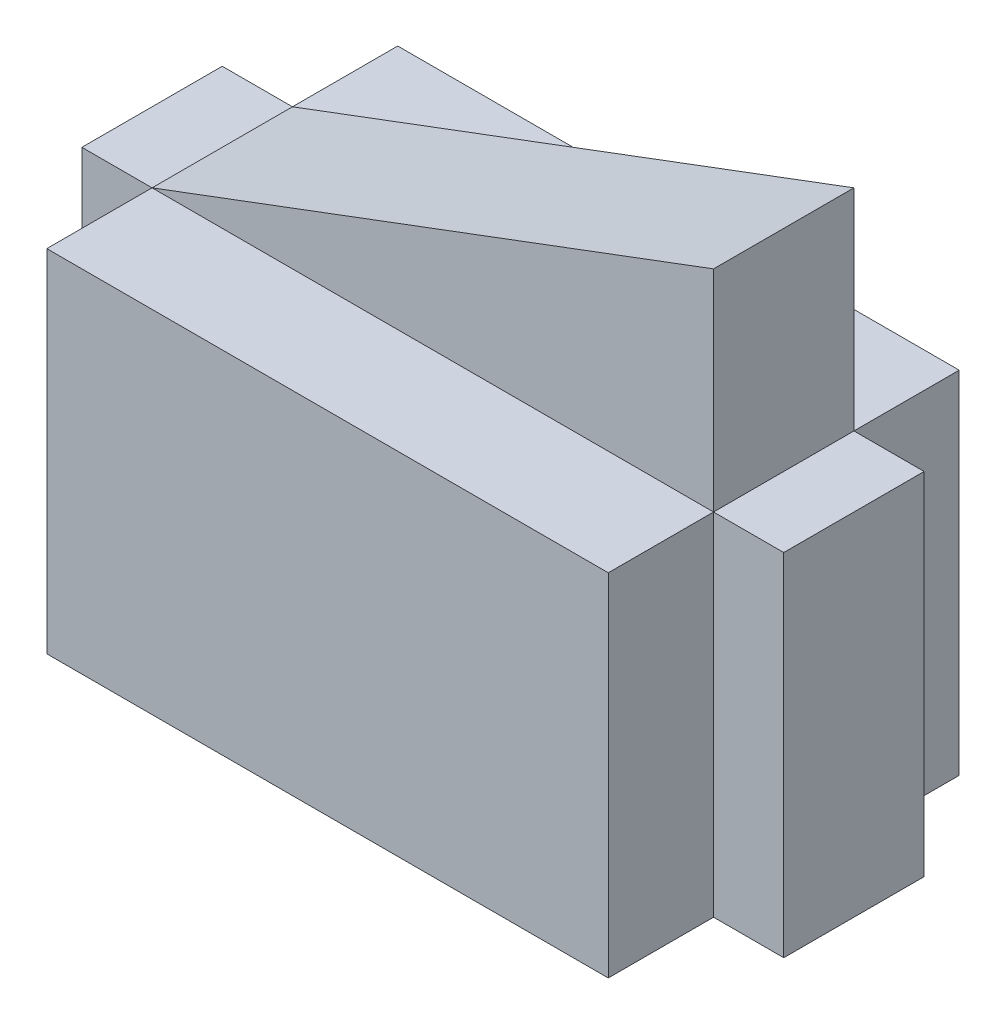
ISO-10303-21;
HEADER;
FILE_DESCRIPTION(('STEP AP214'),'2;1');
FILE_NAME('part.step','',(''),(''),'','','');
FILE_SCHEMA(('AUTOMOTIVE_DESIGN { 1 0 10303 214 1 1 1 1 }'));
ENDSEC;
DATA;
#1=APPLICATION_CONTEXT('core data for automotive mechanical design processes');
#2=APPLICATION_PROTOCOL_DEFINITION('international standard','automotive_design',2000,#1);
#3=PRODUCT_CONTEXT('',#1,'mechanical');
#4=PRODUCT('Part','Part','',(#3));
#5=PRODUCT_RELATED_PRODUCT_CATEGORY('part','',(#4));
#6=PRODUCT_DEFINITION_FORMATION('','',#4);
#7=PRODUCT_DEFINITION_CONTEXT('part definition',#1,'design');
#8=PRODUCT_DEFINITION('design','',#6,#7);
#9=PRODUCT_DEFINITION_SHAPE('','',#8);
#10=(LENGTH_UNIT() NAMED_UNIT(*) SI_UNIT(.MILLI.,.METRE.));
#11=(NAMED_UNIT(*) PLANE_ANGLE_UNIT() SI_UNIT($,.RADIAN.));
#12=(NAMED_UNIT(*) SI_UNIT($,.STERADIAN.) SOLID_ANGLE_UNIT());
#13=UNCERTAINTY_MEASURE_WITH_UNIT(LENGTH_MEASURE(1.E-05),#10,'distance_accuracy_value','');
#14=(GEOMETRIC_REPRESENTATION_CONTEXT(3) GLOBAL_UNCERTAINTY_ASSIGNED_CONTEXT((#13)) GLOBAL_UNIT_ASSIGNED_CONTEXT((#10,
#11,#12)) REPRESENTATION_CONTEXT('',''));
#15=CARTESIAN_POINT('',(0.,0.,0.));
#16=DIRECTION('',(0.,0.,1.));
#17=DIRECTION('',(1.,0.,0.));
#18=AXIS2_PLACEMENT_3D('',#15,#16,#17);
#19=CARTESIAN_POINT('',(4.,5.,5.));
#20=DIRECTION('',(-1.,0.,0.));
#21=DIRECTION('',(0.,-1.,0.));
#22=AXIS2_PLACEMENT_3D('',#19,#20,#21);
#23=PLANE('',#22);
#24=DIRECTION('',(0.,0.,-1.));
#25=VECTOR('',#24,1.);
#26=CARTESIAN_POINT('',(4.,5.,13.5));
#27=LINE('',#26,#25);
#28=CARTESIAN_POINT('',(4.,5.,5.));
#29=VERTEX_POINT('',#28);
#30=CARTESIAN_POINT('',(4.,5.,3.5));
#31=VERTEX_POINT('',#30);
#32=EDGE_CURVE('E150',#29,#31,#27,.T.);
#33=ORIENTED_EDGE('',*,*,#32,.F.);
#34=DIRECTION('',(0.,1.,0.));
#35=VECTOR('',#34,1.);
#36=CARTESIAN_POINT('',(4.,5.,5.));
#37=LINE('',#36,#35);
#38=CARTESIAN_POINT('',(4.,0.,5.));
#39=VERTEX_POINT('',#38);
#40=EDGE_CURVE('E205',#39,#29,#37,.T.);
#41=ORIENTED_EDGE('',*,*,#40,.F.);
#42=DIRECTION('',(0.,0.,-1.));
#43=VECTOR('',#42,1.);
#44=CARTESIAN_POINT('',(4.,0.,5.));
#45=LINE('',#44,#43);
#46=CARTESIAN_POINT('',(4.,0.,3.5));
#47=VERTEX_POINT('',#46);
#48=EDGE_CURVE('E56',#39,#47,#45,.T.);
#49=ORIENTED_EDGE('',*,*,#48,.T.);
#50=DIRECTION('',(0.,1.,0.));
#51=VECTOR('',#50,1.);
#52=CARTESIAN_POINT('',(4.,-2.23606797749979,3.5));
#53=LINE('',#52,#51);
#54=EDGE_CURVE('E258',#47,#31,#53,.T.);
#55=ORIENTED_EDGE('',*,*,#54,.T.);
#56=EDGE_LOOP('',(#33,#41,#49,#55));
#57=FACE_BOUND('',#56,.T.);
#58=ADVANCED_FACE('F33',(#57),#23,.F.);
#59=CARTESIAN_POINT('',(0.,0.,5.));
#60=DIRECTION('',(0.,0.,1.));
#61=DIRECTION('',(1.,0.,0.));
#62=AXIS2_PLACEMENT_3D('',#59,#60,#61);
#63=PLANE('',#62);
#64=ORIENTED_EDGE('',*,*,#40,.T.);
#65=DIRECTION('',(-1.,0.,0.));
#66=VECTOR('',#65,1.);
#67=CARTESIAN_POINT('',(0.,5.,5.));
#68=LINE('',#67,#66);
#69=CARTESIAN_POINT('',(-4.,5.,5.));
#70=VERTEX_POINT('',#69);
#71=EDGE_CURVE('E11',#29,#70,#68,.T.);
#72=ORIENTED_EDGE('',*,*,#71,.T.);
#73=DIRECTION('',(0.,-1.,0.));
#74=VECTOR('',#73,1.);
#75=CARTESIAN_POINT('',(-4.,5.,5.));
#76=LINE('',#75,#74);
#77=CARTESIAN_POINT('',(-4.,0.,5.));
#78=VERTEX_POINT('',#77);
#79=EDGE_CURVE('E173',#70,#78,#76,.T.);
#80=ORIENTED_EDGE('',*,*,#79,.T.);
#81=DIRECTION('',(1.,0.,0.));
#82=VECTOR('',#81,1.);
#83=CARTESIAN_POINT('',(-4.,0.,5.));
#84=LINE('',#83,#82);
#85=EDGE_CURVE('E202',#78,#39,#84,.T.);
#86=ORIENTED_EDGE('',*,*,#85,.T.);
#87=EDGE_LOOP('',(#64,#72,#80,#86));
#88=FACE_BOUND('',#87,.T.);
#89=ADVANCED_FACE('F281',(#88),#63,.T.);
#90=DIRECTION('',(0.,0.,1.));
#91=VECTOR('',#90,1.);
#92=CARTESIAN_POINT('',(4.,5.,-8.5));
#93=LINE('',#92,#91);
#94=CARTESIAN_POINT('',(4.,5.,0.));
#95=VERTEX_POINT('',#94);
#96=CARTESIAN_POINT('',(4.,5.,1.5));
#97=VERTEX_POINT('',#96);
#98=EDGE_CURVE('E230',#95,#97,#93,.T.);
#99=ORIENTED_EDGE('',*,*,#98,.T.);
#100=DIRECTION('',(0.,1.,0.));
#101=VECTOR('',#100,1.);
#102=CARTESIAN_POINT('',(4.,-2.23606797749979,1.5));
#103=LINE('',#102,#101);
#104=CARTESIAN_POINT('',(4.,0.,1.5));
#105=VERTEX_POINT('',#104);
#106=EDGE_CURVE('E48',#105,#97,#103,.T.);
#107=ORIENTED_EDGE('',*,*,#106,.F.);
#108=CARTESIAN_POINT('',(4.,0.,0.));
#109=VERTEX_POINT('',#108);
#110=EDGE_CURVE('E208',#105,#109,#45,.T.);
#111=ORIENTED_EDGE('',*,*,#110,.T.);
#112=DIRECTION('',(0.,1.,0.));
#113=VECTOR('',#112,1.);
#114=CARTESIAN_POINT('',(4.,5.,0.));
#115=LINE('',#114,#113);
#116=EDGE_CURVE('E203',#109,#95,#115,.T.);
#117=ORIENTED_EDGE('',*,*,#116,.T.);
#118=EDGE_LOOP('',(#99,#107,#111,#117));
#119=FACE_BOUND('',#118,.T.);
#120=ADVANCED_FACE('F229',(#119),#23,.F.);
#121=DIRECTION('',(0.,1.,0.));
#122=VECTOR('',#121,1.);
#123=CARTESIAN_POINT('',(4.,5.,3.5));
#124=LINE('',#123,#122);
#125=CARTESIAN_POINT('',(4.,8.,3.5));
#126=VERTEX_POINT('',#125);
#127=EDGE_CURVE('E136',#31,#126,#124,.T.);
#128=ORIENTED_EDGE('',*,*,#127,.F.);
#129=DIRECTION('',(0.,0.,-1.));
#130=VECTOR('',#129,1.);
#131=CARTESIAN_POINT('',(4.,5.,3.5));
#132=LINE('',#131,#130);
#133=EDGE_CURVE('E253',#31,#97,#132,.T.);
#134=ORIENTED_EDGE('',*,*,#133,.T.);
#135=DIRECTION('',(0.,1.,0.));
#136=VECTOR('',#135,1.);
#137=CARTESIAN_POINT('',(4.,5.,1.5));
#138=LINE('',#137,#136);
#139=CARTESIAN_POINT('',(4.,8.,1.5));
#140=VERTEX_POINT('',#139);
#141=EDGE_CURVE('E437',#97,#140,#138,.T.);
#142=ORIENTED_EDGE('',*,*,#141,.T.);
#143=DIRECTION('',(0.,0.,-1.));
#144=VECTOR('',#143,1.);
#145=CARTESIAN_POINT('',(4.,8.,3.5));
#146=LINE('',#145,#144);
#147=EDGE_CURVE('E181',#126,#140,#146,.T.);
#148=ORIENTED_EDGE('',*,*,#147,.F.);
#149=EDGE_LOOP('',(#128,#134,#142,#148));
#150=FACE_BOUND('',#149,.T.);
#151=ADVANCED_FACE('F283',(#150),#23,.F.);
#152=CARTESIAN_POINT('',(0.,0.,0.));
#153=DIRECTION('',(0.,0.,1.));
#154=DIRECTION('',(1.,0.,0.));
#155=AXIS2_PLACEMENT_3D('',#152,#153,#154);
#156=PLANE('',#155);
#157=DIRECTION('',(-1.,0.,0.));
#158=VECTOR('',#157,1.);
#159=CARTESIAN_POINT('',(0.,5.,0.));
#160=LINE('',#159,#158);
#161=CARTESIAN_POINT('',(-4.,5.,0.));
#162=VERTEX_POINT('',#161);
#163=EDGE_CURVE('E175',#95,#162,#160,.T.);
#164=ORIENTED_EDGE('',*,*,#163,.F.);
#165=ORIENTED_EDGE('',*,*,#116,.F.);
#166=DIRECTION('',(1.,0.,0.));
#167=VECTOR('',#166,1.);
#168=CARTESIAN_POINT('',(-4.,0.,0.));
#169=LINE('',#168,#167);
#170=CARTESIAN_POINT('',(-4.,0.,0.));
#171=VERTEX_POINT('',#170);
#172=EDGE_CURVE('E210',#171,#109,#169,.T.);
#173=ORIENTED_EDGE('',*,*,#172,.F.);
#174=DIRECTION('',(0.,-1.,0.));
#175=VECTOR('',#174,1.);
#176=CARTESIAN_POINT('',(-4.,5.,0.));
#177=LINE('',#176,#175);
#178=EDGE_CURVE('E200',#162,#171,#177,.T.);
#179=ORIENTED_EDGE('',*,*,#178,.F.);
#180=EDGE_LOOP('',(#164,#165,#173,#179));
#181=FACE_BOUND('',#180,.T.);
#182=ADVANCED_FACE('F228',(#181),#156,.F.);
#183=CARTESIAN_POINT('',(4.,8.,3.5));
#184=DIRECTION('',(0.351123441588392,-0.936329177569044,0.));
#185=DIRECTION('',(0.936329177569044,0.351123441588392,0.));
#186=AXIS2_PLACEMENT_3D('',#183,#184,#185);
#187=PLANE('',#186);
#188=DIRECTION('',(0.,0.,-1.));
#189=VECTOR('',#188,1.);
#190=CARTESIAN_POINT('',(-4.,5.,3.5));
#191=LINE('',#190,#189);
#192=CARTESIAN_POINT('',(-4.,5.,3.5));
#193=VERTEX_POINT('',#192);
#194=CARTESIAN_POINT('',(-4.,5.,1.5));
#195=VERTEX_POINT('',#194);
#196=EDGE_CURVE('E141',#193,#195,#191,.T.);
#197=ORIENTED_EDGE('',*,*,#196,.F.);
#198=DIRECTION('',(-0.936329177569045,-0.351123441588392,0.));
#199=VECTOR('',#198,1.);
#200=CARTESIAN_POINT('',(4.,8.,3.5));
#201=LINE('',#200,#199);
#202=EDGE_CURVE('E131',#126,#193,#201,.T.);
#203=ORIENTED_EDGE('',*,*,#202,.F.);
#204=ORIENTED_EDGE('',*,*,#147,.T.);
#205=DIRECTION('',(-0.936329177569045,-0.351123441588392,0.));
#206=VECTOR('',#205,1.);
#207=CARTESIAN_POINT('',(4.,8.,1.5));
#208=LINE('',#207,#206);
#209=EDGE_CURVE('E179',#140,#195,#208,.T.);
#210=ORIENTED_EDGE('',*,*,#209,.T.);
#211=EDGE_LOOP('',(#197,#203,#204,#210));
#212=FACE_BOUND('',#211,.T.);
#213=ADVANCED_FACE('F177',(#212),#187,.F.);
#214=CARTESIAN_POINT('',(-4.,5.,5.));
#215=DIRECTION('',(0.,-1.,0.));
#216=DIRECTION('',(1.,0.,0.));
#217=AXIS2_PLACEMENT_3D('',#214,#215,#216);
#218=PLANE('',#217);
#219=ORIENTED_EDGE('',*,*,#133,.F.);
#220=DIRECTION('',(1.,0.,0.));
#221=VECTOR('',#220,1.);
#222=CARTESIAN_POINT('',(4.,5.,3.5));
#223=LINE('',#222,#221);
#224=CARTESIAN_POINT('',(5.,5.,3.5));
#225=VERTEX_POINT('',#224);
#226=EDGE_CURVE('E249',#31,#225,#223,.T.);
#227=ORIENTED_EDGE('',*,*,#226,.T.);
#228=DIRECTION('',(0.,0.,-1.));
#229=VECTOR('',#228,1.);
#230=CARTESIAN_POINT('',(5.,5.,1.5));
#231=LINE('',#230,#229);
#232=CARTESIAN_POINT('',(5.,5.,1.5));
#233=VERTEX_POINT('',#232);
#234=EDGE_CURVE('E252',#225,#233,#231,.T.);
#235=ORIENTED_EDGE('',*,*,#234,.T.);
#236=DIRECTION('',(-1.,0.,0.));
#237=VECTOR('',#236,1.);
#238=CARTESIAN_POINT('',(4.,5.,1.5));
#239=LINE('',#238,#237);
#240=EDGE_CURVE('E256',#233,#97,#239,.T.);
#241=ORIENTED_EDGE('',*,*,#240,.T.);
#242=EDGE_LOOP('',(#219,#227,#235,#241));
#243=FACE_BOUND('',#242,.T.);
#244=ADVANCED_FACE('F315',(#243),#218,.F.);
#245=CARTESIAN_POINT('',(-4.,5.,5.));
#246=DIRECTION('',(1.,0.,0.));
#247=DIRECTION('',(0.,1.,0.));
#248=AXIS2_PLACEMENT_3D('',#245,#246,#247);
#249=PLANE('',#248);
#250=ORIENTED_EDGE('',*,*,#79,.F.);
#251=DIRECTION('',(0.,0.,1.));
#252=VECTOR('',#251,1.);
#253=CARTESIAN_POINT('',(-4.,5.,0.));
#254=LINE('',#253,#252);
#255=EDGE_CURVE('E148',#193,#70,#254,.T.);
#256=ORIENTED_EDGE('',*,*,#255,.F.);
#257=DIRECTION('',(0.,1.,0.));
#258=VECTOR('',#257,1.);
#259=CARTESIAN_POINT('',(-4.,-2.23606797749979,3.5));
#260=LINE('',#259,#258);
#261=CARTESIAN_POINT('',(-4.,0.,3.5));
#262=VERTEX_POINT('',#261);
#263=EDGE_CURVE('E171',#262,#193,#260,.T.);
#264=ORIENTED_EDGE('',*,*,#263,.F.);
#265=DIRECTION('',(0.,0.,-1.));
#266=VECTOR('',#265,1.);
#267=CARTESIAN_POINT('',(-4.,0.,5.));
#268=LINE('',#267,#266);
#269=EDGE_CURVE('E41',#78,#262,#268,.T.);
#270=ORIENTED_EDGE('',*,*,#269,.F.);
#271=EDGE_LOOP('',(#250,#256,#264,#270));
#272=FACE_BOUND('',#271,.T.);
#273=ADVANCED_FACE('F169',(#272),#249,.F.);
#274=DIRECTION('',(0.,1.,0.));
#275=VECTOR('',#274,1.);
#276=CARTESIAN_POINT('',(-4.,-2.23606797749979,1.5));
#277=LINE('',#276,#275);
#278=CARTESIAN_POINT('',(-4.,0.,1.5));
#279=VERTEX_POINT('',#278);
#280=EDGE_CURVE('E165',#279,#195,#277,.T.);
#281=ORIENTED_EDGE('',*,*,#280,.T.);
#282=EDGE_CURVE('E174',#162,#195,#254,.T.);
#283=ORIENTED_EDGE('',*,*,#282,.F.);
#284=ORIENTED_EDGE('',*,*,#178,.T.);
#285=EDGE_CURVE('E215',#279,#171,#268,.T.);
#286=ORIENTED_EDGE('',*,*,#285,.F.);
#287=EDGE_LOOP('',(#281,#283,#284,#286));
#288=FACE_BOUND('',#287,.T.);
#289=ADVANCED_FACE('F35',(#288),#249,.F.);
#290=CARTESIAN_POINT('',(-4.,0.,5.));
#291=DIRECTION('',(0.,1.,0.));
#292=DIRECTION('',(0.,0.,1.));
#293=AXIS2_PLACEMENT_3D('',#290,#291,#292);
#294=PLANE('',#293);
#295=CARTESIAN_POINT('',(0.,0.,2.5));
#296=DIRECTION('',(0.,-1.,0.));
#297=DIRECTION('',(0.,0.,-1.));
#298=AXIS2_PLACEMENT_3D('',#295,#296,#297);
#299=CIRCLE('',#298,1.25);
#300=CARTESIAN_POINT('',(0.,0.,1.25));
#301=VERTEX_POINT('',#300);
#302=EDGE_CURVE('E443',#301,#301,#299,.T.);
#303=ORIENTED_EDGE('',*,*,#302,.F.);
#304=EDGE_LOOP('',(#303));
#305=FACE_BOUND('',#304,.T.);
#306=ORIENTED_EDGE('',*,*,#172,.T.);
#307=ORIENTED_EDGE('',*,*,#110,.F.);
#308=DIRECTION('',(1.,0.,0.));
#309=VECTOR('',#308,1.);
#310=CARTESIAN_POINT('',(4.,0.,1.5));
#311=LINE('',#310,#309);
#312=CARTESIAN_POINT('',(5.,0.,1.5));
#313=VERTEX_POINT('',#312);
#314=EDGE_CURVE('E233',#105,#313,#311,.T.);
#315=ORIENTED_EDGE('',*,*,#314,.T.);
#316=DIRECTION('',(0.,0.,1.));
#317=VECTOR('',#316,1.);
#318=CARTESIAN_POINT('',(5.,0.,1.5));
#319=LINE('',#318,#317);
#320=CARTESIAN_POINT('',(5.,0.,3.5));
#321=VERTEX_POINT('',#320);
#322=EDGE_CURVE('E242',#313,#321,#319,.T.);
#323=ORIENTED_EDGE('',*,*,#322,.T.);
#324=DIRECTION('',(-1.,0.,0.));
#325=VECTOR('',#324,1.);
#326=CARTESIAN_POINT('',(4.,0.,3.5));
#327=LINE('',#326,#325);
#328=EDGE_CURVE('E241',#321,#47,#327,.T.);
#329=ORIENTED_EDGE('',*,*,#328,.T.);
#330=ORIENTED_EDGE('',*,*,#48,.F.);
#331=ORIENTED_EDGE('',*,*,#85,.F.);
#332=ORIENTED_EDGE('',*,*,#269,.T.);
#333=DIRECTION('',(-1.,0.,0.));
#334=VECTOR('',#333,1.);
#335=CARTESIAN_POINT('',(-4.,0.,3.5));
#336=LINE('',#335,#334);
#337=CARTESIAN_POINT('',(-5.,0.,3.5));
#338=VERTEX_POINT('',#337);
#339=EDGE_CURVE('E185',#262,#338,#336,.T.);
#340=ORIENTED_EDGE('',*,*,#339,.T.);
#341=DIRECTION('',(0.,0.,-1.));
#342=VECTOR('',#341,1.);
#343=CARTESIAN_POINT('',(-5.,0.,1.5));
#344=LINE('',#343,#342);
#345=CARTESIAN_POINT('',(-5.,0.,1.5));
#346=VERTEX_POINT('',#345);
#347=EDGE_CURVE('E186',#338,#346,#344,.T.);
#348=ORIENTED_EDGE('',*,*,#347,.T.);
#349=DIRECTION('',(1.,0.,0.));
#350=VECTOR('',#349,1.);
#351=CARTESIAN_POINT('',(-4.,0.,1.5));
#352=LINE('',#351,#350);
#353=EDGE_CURVE('E197',#346,#279,#352,.T.);
#354=ORIENTED_EDGE('',*,*,#353,.T.);
#355=ORIENTED_EDGE('',*,*,#285,.T.);
#356=EDGE_LOOP('',(#306,#307,#315,#323,#329,#330,#331,#332,#340,#348,#354,#355));
#357=FACE_BOUND('',#356,.T.);
#358=ADVANCED_FACE('F220',(#305,#357),#294,.F.);
#359=DIRECTION('',(1.,0.,0.));
#360=VECTOR('',#359,1.);
#361=CARTESIAN_POINT('',(-4.,5.,3.5));
#362=LINE('',#361,#360);
#363=CARTESIAN_POINT('',(-5.,5.,3.5));
#364=VERTEX_POINT('',#363);
#365=EDGE_CURVE('E157',#364,#193,#362,.T.);
#366=ORIENTED_EDGE('',*,*,#365,.T.);
#367=ORIENTED_EDGE('',*,*,#196,.T.);
#368=DIRECTION('',(-1.,0.,0.));
#369=VECTOR('',#368,1.);
#370=CARTESIAN_POINT('',(-4.,5.,1.5));
#371=LINE('',#370,#369);
#372=CARTESIAN_POINT('',(-5.,5.,1.5));
#373=VERTEX_POINT('',#372);
#374=EDGE_CURVE('E244',#195,#373,#371,.T.);
#375=ORIENTED_EDGE('',*,*,#374,.T.);
#376=DIRECTION('',(0.,0.,1.));
#377=VECTOR('',#376,1.);
#378=CARTESIAN_POINT('',(-5.,5.,1.5));
#379=LINE('',#378,#377);
#380=EDGE_CURVE('E161',#373,#364,#379,.T.);
#381=ORIENTED_EDGE('',*,*,#380,.T.);
#382=EDGE_LOOP('',(#366,#367,#375,#381));
#383=FACE_BOUND('',#382,.T.);
#384=ADVANCED_FACE('F158',(#383),#218,.F.);
#385=CARTESIAN_POINT('',(-4.,-2.23606797749979,3.5));
#386=DIRECTION('',(0.,0.,1.));
#387=DIRECTION('',(1.,0.,0.));
#388=AXIS2_PLACEMENT_3D('',#385,#386,#387);
#389=PLANE('',#388);
#390=ORIENTED_EDGE('',*,*,#339,.F.);
#391=ORIENTED_EDGE('',*,*,#263,.T.);
#392=ORIENTED_EDGE('',*,*,#365,.F.);
#393=DIRECTION('',(0.,1.,0.));
#394=VECTOR('',#393,1.);
#395=CARTESIAN_POINT('',(-5.,-2.23606797749979,3.5));
#396=LINE('',#395,#394);
#397=EDGE_CURVE('E187',#338,#364,#396,.T.);
#398=ORIENTED_EDGE('',*,*,#397,.F.);
#399=EDGE_LOOP('',(#390,#391,#392,#398));
#400=FACE_BOUND('',#399,.T.);
#401=ADVANCED_FACE('F184',(#400),#389,.T.);
#402=CARTESIAN_POINT('',(-5.,-2.23606797749979,1.5));
#403=DIRECTION('',(-1.,0.,0.));
#404=DIRECTION('',(0.,-1.,0.));
#405=AXIS2_PLACEMENT_3D('',#402,#403,#404);
#406=PLANE('',#405);
#407=ORIENTED_EDGE('',*,*,#347,.F.);
#408=ORIENTED_EDGE('',*,*,#397,.T.);
#409=ORIENTED_EDGE('',*,*,#380,.F.);
#410=DIRECTION('',(0.,1.,0.));
#411=VECTOR('',#410,1.);
#412=CARTESIAN_POINT('',(-5.,-2.23606797749979,1.5));
#413=LINE('',#412,#411);
#414=EDGE_CURVE('E190',#346,#373,#413,.T.);
#415=ORIENTED_EDGE('',*,*,#414,.F.);
#416=EDGE_LOOP('',(#407,#408,#409,#415));
#417=FACE_BOUND('',#416,.T.);
#418=ADVANCED_FACE('F271',(#417),#406,.T.);
#419=CARTESIAN_POINT('',(-4.,-2.23606797749979,1.5));
#420=DIRECTION('',(0.,0.,-1.));
#421=DIRECTION('',(-1.,0.,0.));
#422=AXIS2_PLACEMENT_3D('',#419,#420,#421);
#423=PLANE('',#422);
#424=ORIENTED_EDGE('',*,*,#353,.F.);
#425=ORIENTED_EDGE('',*,*,#414,.T.);
#426=ORIENTED_EDGE('',*,*,#374,.F.);
#427=ORIENTED_EDGE('',*,*,#280,.F.);
#428=EDGE_LOOP('',(#424,#425,#426,#427));
#429=FACE_BOUND('',#428,.T.);
#430=ADVANCED_FACE('F268',(#429),#423,.T.);
#431=CARTESIAN_POINT('',(4.,-2.23606797749979,1.5));
#432=DIRECTION('',(0.,0.,-1.));
#433=DIRECTION('',(-1.,0.,0.));
#434=AXIS2_PLACEMENT_3D('',#431,#432,#433);
#435=PLANE('',#434);
#436=ORIENTED_EDGE('',*,*,#314,.F.);
#437=ORIENTED_EDGE('',*,*,#106,.T.);
#438=ORIENTED_EDGE('',*,*,#240,.F.);
#439=DIRECTION('',(0.,1.,0.));
#440=VECTOR('',#439,1.);
#441=CARTESIAN_POINT('',(5.,-2.23606797749979,1.5));
#442=LINE('',#441,#440);
#443=EDGE_CURVE('E240',#313,#233,#442,.T.);
#444=ORIENTED_EDGE('',*,*,#443,.F.);
#445=EDGE_LOOP('',(#436,#437,#438,#444));
#446=FACE_BOUND('',#445,.T.);
#447=ADVANCED_FACE('F237',(#446),#435,.T.);
#448=CARTESIAN_POINT('',(5.,-2.23606797749979,1.5));
#449=DIRECTION('',(1.,0.,0.));
#450=DIRECTION('',(0.,1.,0.));
#451=AXIS2_PLACEMENT_3D('',#448,#449,#450);
#452=PLANE('',#451);
#453=ORIENTED_EDGE('',*,*,#322,.F.);
#454=ORIENTED_EDGE('',*,*,#443,.T.);
#455=ORIENTED_EDGE('',*,*,#234,.F.);
#456=DIRECTION('',(0.,1.,0.));
#457=VECTOR('',#456,1.);
#458=CARTESIAN_POINT('',(5.,-2.23606797749979,3.5));
#459=LINE('',#458,#457);
#460=EDGE_CURVE('E261',#321,#225,#459,.T.);
#461=ORIENTED_EDGE('',*,*,#460,.F.);
#462=EDGE_LOOP('',(#453,#454,#455,#461));
#463=FACE_BOUND('',#462,.T.);
#464=ADVANCED_FACE('F364',(#463),#452,.T.);
#465=CARTESIAN_POINT('',(4.,-2.23606797749979,3.5));
#466=DIRECTION('',(0.,0.,1.));
#467=DIRECTION('',(1.,0.,0.));
#468=AXIS2_PLACEMENT_3D('',#465,#466,#467);
#469=PLANE('',#468);
#470=ORIENTED_EDGE('',*,*,#328,.F.);
#471=ORIENTED_EDGE('',*,*,#460,.T.);
#472=ORIENTED_EDGE('',*,*,#226,.F.);
#473=ORIENTED_EDGE('',*,*,#54,.F.);
#474=EDGE_LOOP('',(#470,#471,#472,#473));
#475=FACE_BOUND('',#474,.T.);
#476=ADVANCED_FACE('F359',(#475),#469,.T.);
#477=CARTESIAN_POINT('',(0.,0.,3.5));
#478=DIRECTION('',(0.,0.,1.));
#479=DIRECTION('',(1.,0.,0.));
#480=AXIS2_PLACEMENT_3D('',#477,#478,#479);
#481=PLANE('',#480);
#482=ORIENTED_EDGE('',*,*,#202,.T.);
#483=DIRECTION('',(1.,0.,0.));
#484=VECTOR('',#483,1.);
#485=CARTESIAN_POINT('',(4.,5.,3.5));
#486=LINE('',#485,#484);
#487=EDGE_CURVE('E134',#193,#31,#486,.T.);
#488=ORIENTED_EDGE('',*,*,#487,.T.);
#489=ORIENTED_EDGE('',*,*,#127,.T.);
#490=EDGE_LOOP('',(#482,#488,#489));
#491=FACE_BOUND('',#490,.T.);
#492=ADVANCED_FACE('F133',(#491),#481,.T.);
#493=CARTESIAN_POINT('',(0.,0.,1.5));
#494=DIRECTION('',(0.,0.,1.));
#495=DIRECTION('',(1.,0.,0.));
#496=AXIS2_PLACEMENT_3D('',#493,#494,#495);
#497=PLANE('',#496);
#498=ORIENTED_EDGE('',*,*,#141,.F.);
#499=DIRECTION('',(-1.,0.,0.));
#500=VECTOR('',#499,1.);
#501=CARTESIAN_POINT('',(4.,5.,1.5));
#502=LINE('',#501,#500);
#503=EDGE_CURVE('E429',#97,#195,#502,.T.);
#504=ORIENTED_EDGE('',*,*,#503,.T.);
#505=ORIENTED_EDGE('',*,*,#209,.F.);
#506=EDGE_LOOP('',(#498,#504,#505));
#507=FACE_BOUND('',#506,.T.);
#508=ADVANCED_FACE('F376',(#507),#497,.F.);
#509=CARTESIAN_POINT('',(4.,5.,-8.5));
#510=DIRECTION('',(0.,1.,0.));
#511=DIRECTION('',(-1.,0.,0.));
#512=AXIS2_PLACEMENT_3D('',#509,#510,#511);
#513=PLANE('',#512);
#514=ORIENTED_EDGE('',*,*,#163,.T.);
#515=ORIENTED_EDGE('',*,*,#282,.T.);
#516=ORIENTED_EDGE('',*,*,#503,.F.);
#517=ORIENTED_EDGE('',*,*,#98,.F.);
#518=EDGE_LOOP('',(#514,#515,#516,#517));
#519=FACE_BOUND('',#518,.T.);
#520=ADVANCED_FACE('F388',(#519),#513,.T.);
#521=CARTESIAN_POINT('',(4.,5.,13.5));
#522=DIRECTION('',(0.,1.,0.));
#523=DIRECTION('',(-1.,0.,0.));
#524=AXIS2_PLACEMENT_3D('',#521,#522,#523);
#525=PLANE('',#524);
#526=ORIENTED_EDGE('',*,*,#32,.T.);
#527=ORIENTED_EDGE('',*,*,#487,.F.);
#528=ORIENTED_EDGE('',*,*,#255,.T.);
#529=ORIENTED_EDGE('',*,*,#71,.F.);
#530=EDGE_LOOP('',(#526,#527,#528,#529));
#531=FACE_BOUND('',#530,.T.);
#532=ADVANCED_FACE('F146',(#531),#525,.T.);
#533=CARTESIAN_POINT('',(0.,1.,2.5));
#534=DIRECTION('',(0.,-1.,0.));
#535=DIRECTION('',(0.,0.,-1.));
#536=AXIS2_PLACEMENT_3D('',#533,#534,#535);
#537=CYLINDRICAL_SURFACE('',#536,1.25);
#538=CARTESIAN_POINT('',(0.,1.,2.5));
#539=DIRECTION('',(0.,-1.,0.));
#540=DIRECTION('',(0.,0.,-1.));
#541=AXIS2_PLACEMENT_3D('',#538,#539,#540);
#542=CIRCLE('',#541,1.25);
#543=CARTESIAN_POINT('',(0.,1.,1.25));
#544=VERTEX_POINT('',#543);
#545=EDGE_CURVE('E151',#544,#544,#542,.T.);
#546=ORIENTED_EDGE('',*,*,#545,.F.);
#547=EDGE_LOOP('',(#546));
#548=FACE_BOUND('',#547,.T.);
#549=ORIENTED_EDGE('',*,*,#302,.T.);
#550=EDGE_LOOP('',(#549));
#551=FACE_BOUND('',#550,.T.);
#552=ADVANCED_FACE('F387',(#548,#551),#537,.F.);
#553=CARTESIAN_POINT('',(0.,1.,2.5));
#554=DIRECTION('',(0.,-1.,0.));
#555=DIRECTION('',(0.,0.,-1.));
#556=AXIS2_PLACEMENT_3D('',#553,#554,#555);
#557=PLANE('',#556);
#558=ORIENTED_EDGE('',*,*,#545,.T.);
#559=EDGE_LOOP('',(#558));
#560=FACE_BOUND('',#559,.T.);
#561=ADVANCED_FACE('F400',(#560),#557,.T.);
#562=CLOSED_SHELL('',(#58,#89,#120,#151,#182,#213,#244,#273,#289,#358,#384,#401,#418,#430,#447,
#464,#476,#492,#508,#520,#532,#552,#561));
#563=MANIFOLD_SOLID_BREP('B2',#562);
#564=ADVANCED_BREP_SHAPE_REPRESENTATION('',(#18,#563),#14);
#565=SHAPE_DEFINITION_REPRESENTATION(#9,#564);
ENDSEC;
END-ISO-10303-21;
